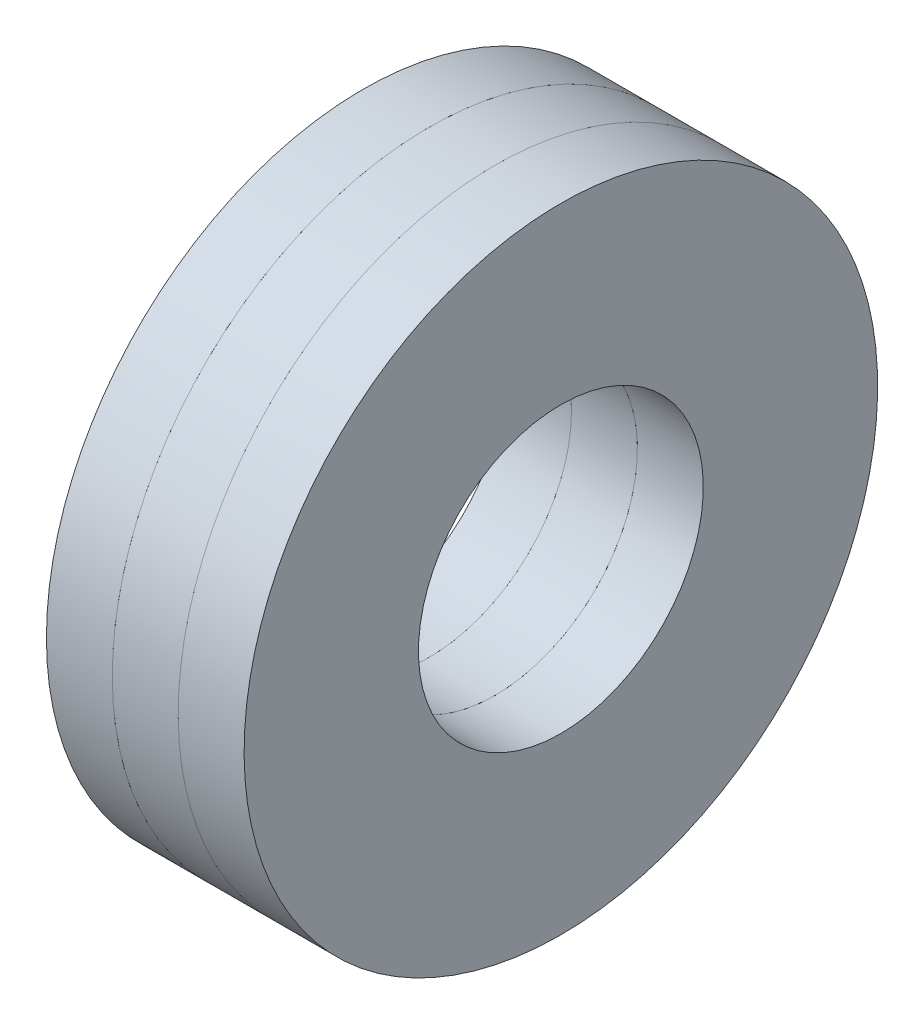
ISO-10303-21;
HEADER;
FILE_DESCRIPTION(('STEP AP214'),'2;1');
FILE_NAME('part.step','',(''),(''),'','','');
FILE_SCHEMA(('AUTOMOTIVE_DESIGN { 1 0 10303 214 1 1 1 1 }'));
ENDSEC;
DATA;
#1=APPLICATION_CONTEXT('core data for automotive mechanical design processes');
#2=APPLICATION_PROTOCOL_DEFINITION('international standard','automotive_design',2000,#1);
#3=PRODUCT_CONTEXT('',#1,'mechanical');
#4=PRODUCT('Part','Part','',(#3));
#5=PRODUCT_RELATED_PRODUCT_CATEGORY('part','',(#4));
#6=PRODUCT_DEFINITION_FORMATION('','',#4);
#7=PRODUCT_DEFINITION_CONTEXT('part definition',#1,'design');
#8=PRODUCT_DEFINITION('design','',#6,#7);
#9=PRODUCT_DEFINITION_SHAPE('','',#8);
#10=(LENGTH_UNIT() NAMED_UNIT(*) SI_UNIT(.MILLI.,.METRE.));
#11=(NAMED_UNIT(*) PLANE_ANGLE_UNIT() SI_UNIT($,.RADIAN.));
#12=(NAMED_UNIT(*) SI_UNIT($,.STERADIAN.) SOLID_ANGLE_UNIT());
#13=UNCERTAINTY_MEASURE_WITH_UNIT(LENGTH_MEASURE(1.E-05),#10,'distance_accuracy_value','');
#14=(GEOMETRIC_REPRESENTATION_CONTEXT(3) GLOBAL_UNCERTAINTY_ASSIGNED_CONTEXT((#13)) GLOBAL_UNIT_ASSIGNED_CONTEXT((#10,
#11,#12)) REPRESENTATION_CONTEXT('',''));
#15=CARTESIAN_POINT('',(0.,0.,0.));
#16=DIRECTION('',(0.,0.,1.));
#17=DIRECTION('',(1.,0.,0.));
#18=AXIS2_PLACEMENT_3D('',#15,#16,#17);
#19=CARTESIAN_POINT('',(-31.563667746159,1.58929944387864,-2.41787070547161));
#20=DIRECTION('',(-1.,0.,0.));
#21=DIRECTION('',(0.,0.,1.));
#22=AXIS2_PLACEMENT_3D('',#19,#20,#21);
#23=CYLINDRICAL_SURFACE('',#22,3.5687);
#24=CARTESIAN_POINT('',(3.36133225384091,1.58929944387864,-2.41787070547161));
#25=DIRECTION('',(-1.,0.,0.));
#26=DIRECTION('',(0.,0.,1.));
#27=AXIS2_PLACEMENT_3D('',#24,#25,#26);
#28=CIRCLE('',#27,3.5687);
#29=CARTESIAN_POINT('',(3.36133225384091,1.58929944387864,1.15082929452839));
#30=VERTEX_POINT('',#29);
#31=EDGE_CURVE('P0_E10',#30,#30,#28,.T.);
#32=ORIENTED_EDGE('',*,*,#31,.F.);
#33=EDGE_LOOP('',(#32));
#34=FACE_BOUND('',#33,.T.);
#35=CARTESIAN_POINT('',(1.71033225384091,1.58929944387864,-2.41787070547161));
#36=DIRECTION('',(-1.,0.,0.));
#37=DIRECTION('',(0.,0.,1.));
#38=AXIS2_PLACEMENT_3D('',#35,#36,#37);
#39=CIRCLE('',#38,3.5687);
#40=CARTESIAN_POINT('',(1.71033225384091,1.58929944387864,1.15082929452839));
#41=VERTEX_POINT('',#40);
#42=EDGE_CURVE('P0_E28',#41,#41,#39,.T.);
#43=ORIENTED_EDGE('',*,*,#42,.T.);
#44=EDGE_LOOP('',(#43));
#45=FACE_BOUND('',#44,.T.);
#46=ADVANCED_FACE('P0_F14',(#34,#45),#23,.F.);
#47=CARTESIAN_POINT('',(3.36133225384091,5.15799944387864,-2.41787070547161));
#48=DIRECTION('',(-1.,0.,0.));
#49=DIRECTION('',(0.,0.,1.));
#50=AXIS2_PLACEMENT_3D('',#47,#48,#49);
#51=PLANE('',#50);
#52=CARTESIAN_POINT('',(3.36133225384091,1.58929944387864,-2.41787070547161));
#53=DIRECTION('',(-1.,0.,0.));
#54=DIRECTION('',(0.,0.,1.));
#55=AXIS2_PLACEMENT_3D('',#52,#53,#54);
#56=CIRCLE('',#55,7.9375);
#57=CARTESIAN_POINT('',(3.36133225384091,1.58929944387864,5.51962929452839));
#58=VERTEX_POINT('',#57);
#59=EDGE_CURVE('P0_E20',#58,#58,#56,.T.);
#60=ORIENTED_EDGE('',*,*,#59,.F.);
#61=EDGE_LOOP('',(#60));
#62=FACE_BOUND('',#61,.T.);
#63=ORIENTED_EDGE('',*,*,#31,.T.);
#64=EDGE_LOOP('',(#63));
#65=FACE_BOUND('',#64,.T.);
#66=ADVANCED_FACE('P0_F43',(#62,#65),#51,.F.);
#67=CARTESIAN_POINT('',(-31.563667746159,1.58929944387864,-2.41787070547161));
#68=DIRECTION('',(-1.,0.,0.));
#69=DIRECTION('',(0.,0.,1.));
#70=AXIS2_PLACEMENT_3D('',#67,#68,#69);
#71=CYLINDRICAL_SURFACE('',#70,7.9375);
#72=CARTESIAN_POINT('',(1.71033225384091,1.58929944387864,-2.41787070547161));
#73=DIRECTION('',(-1.,0.,0.));
#74=DIRECTION('',(0.,0.,1.));
#75=AXIS2_PLACEMENT_3D('',#72,#73,#74);
#76=CIRCLE('',#75,7.9375);
#77=CARTESIAN_POINT('',(1.71033225384091,1.58929944387864,5.51962929452839));
#78=VERTEX_POINT('',#77);
#79=EDGE_CURVE('P0_E24',#78,#78,#76,.T.);
#80=ORIENTED_EDGE('',*,*,#79,.F.);
#81=EDGE_LOOP('',(#80));
#82=FACE_BOUND('',#81,.T.);
#83=ORIENTED_EDGE('',*,*,#59,.T.);
#84=EDGE_LOOP('',(#83));
#85=FACE_BOUND('',#84,.T.);
#86=ADVANCED_FACE('P0_F38',(#82,#85),#71,.T.);
#87=CARTESIAN_POINT('',(1.71033225384091,9.52679944387864,-2.41787070547161));
#88=DIRECTION('',(1.,0.,0.));
#89=DIRECTION('',(0.,0.,-1.));
#90=AXIS2_PLACEMENT_3D('',#87,#88,#89);
#91=PLANE('',#90);
#92=ORIENTED_EDGE('',*,*,#42,.F.);
#93=EDGE_LOOP('',(#92));
#94=FACE_BOUND('',#93,.T.);
#95=ORIENTED_EDGE('',*,*,#79,.T.);
#96=EDGE_LOOP('',(#95));
#97=FACE_BOUND('',#96,.T.);
#98=ADVANCED_FACE('P0_F35',(#94,#97),#91,.F.);
#99=CLOSED_SHELL('',(#46,#66,#86,#98));
#100=MANIFOLD_SOLID_BREP('P0_B1',#99);
#101=CARTESIAN_POINT('',(38.2863322538409,1.58929944387864,-2.41787070547162));
#102=DIRECTION('',(1.,0.,0.));
#103=DIRECTION('',(0.,0.934083853091867,0.35705371499685));
#104=AXIS2_PLACEMENT_3D('',#101,#102,#103);
#105=CYLINDRICAL_SURFACE('',#104,3.5687);
#106=CARTESIAN_POINT('',(3.36133225384091,1.58929944387864,-2.41787070547162));
#107=DIRECTION('',(1.,0.,0.));
#108=DIRECTION('',(0.,0.934083853091867,0.35705371499685));
#109=AXIS2_PLACEMENT_3D('',#106,#107,#108);
#110=CIRCLE('',#109,3.5687);
#111=CARTESIAN_POINT('',(3.36133225384091,4.92276449040759,-1.14365311276236));
#112=VERTEX_POINT('',#111);
#113=EDGE_CURVE('P1_E10',#112,#112,#110,.T.);
#114=ORIENTED_EDGE('',*,*,#113,.F.);
#115=EDGE_LOOP('',(#114));
#116=FACE_BOUND('',#115,.T.);
#117=CARTESIAN_POINT('',(5.01233225384091,1.58929944387864,-2.41787070547162));
#118=DIRECTION('',(1.,0.,0.));
#119=DIRECTION('',(0.,0.934083853091867,0.35705371499685));
#120=AXIS2_PLACEMENT_3D('',#117,#118,#119);
#121=CIRCLE('',#120,3.5687);
#122=CARTESIAN_POINT('',(5.01233225384091,4.92276449040759,-1.14365311276236));
#123=VERTEX_POINT('',#122);
#124=EDGE_CURVE('P1_E32',#123,#123,#121,.T.);
#125=ORIENTED_EDGE('',*,*,#124,.T.);
#126=EDGE_LOOP('',(#125));
#127=FACE_BOUND('',#126,.T.);
#128=ADVANCED_FACE('P1_F14',(#116,#127),#105,.F.);
#129=CARTESIAN_POINT('',(3.36133225384091,0.315081851169382,0.915594341057329));
#130=DIRECTION('',(1.,0.,0.));
#131=DIRECTION('',(0.,0.934083853091867,0.35705371499685));
#132=AXIS2_PLACEMENT_3D('',#129,#130,#131);
#133=PLANE('',#132);
#134=CARTESIAN_POINT('',(3.36133225384091,1.58929944387864,-2.41787070547162));
#135=DIRECTION('',(1.,0.,0.));
#136=DIRECTION('',(0.,0.934083853091867,0.35705371499685));
#137=AXIS2_PLACEMENT_3D('',#134,#135,#136);
#138=CIRCLE('',#137,7.9375);
#139=CARTESIAN_POINT('',(3.36133225384091,9.00359002779533,0.416243157315883));
#140=VERTEX_POINT('',#139);
#141=EDGE_CURVE('P1_E21',#140,#140,#138,.T.);
#142=ORIENTED_EDGE('',*,*,#141,.F.);
#143=EDGE_LOOP('',(#142));
#144=FACE_BOUND('',#143,.T.);
#145=ORIENTED_EDGE('',*,*,#113,.T.);
#146=EDGE_LOOP('',(#145));
#147=FACE_BOUND('',#146,.T.);
#148=ADVANCED_FACE('P1_F48',(#144,#147),#133,.F.);
#149=CARTESIAN_POINT('',(38.2863322538409,1.58929944387864,-2.41787070547162));
#150=DIRECTION('',(1.,0.,0.));
#151=DIRECTION('',(0.,0.934083853091867,0.35705371499685));
#152=AXIS2_PLACEMENT_3D('',#149,#150,#151);
#153=CYLINDRICAL_SURFACE('',#152,7.9375);
#154=CARTESIAN_POINT('',(5.01233225384091,1.58929944387864,-2.41787070547162));
#155=DIRECTION('',(1.,0.,0.));
#156=DIRECTION('',(0.,0.934083853091867,0.35705371499685));
#157=AXIS2_PLACEMENT_3D('',#154,#155,#156);
#158=CIRCLE('',#157,7.9375);
#159=CARTESIAN_POINT('',(5.01233225384091,9.00359002779533,0.416243157315883));
#160=VERTEX_POINT('',#159);
#161=EDGE_CURVE('P1_E27',#160,#160,#158,.T.);
#162=ORIENTED_EDGE('',*,*,#161,.F.);
#163=EDGE_LOOP('',(#162));
#164=FACE_BOUND('',#163,.T.);
#165=ORIENTED_EDGE('',*,*,#141,.T.);
#166=EDGE_LOOP('',(#165));
#167=FACE_BOUND('',#166,.T.);
#168=ADVANCED_FACE('P1_F43',(#164,#167),#153,.T.);
#169=CARTESIAN_POINT('',(5.01233225384091,-1.24481441890886,4.99641987844508));
#170=DIRECTION('',(-1.,0.,0.));
#171=DIRECTION('',(0.,-0.934083853091867,-0.35705371499685));
#172=AXIS2_PLACEMENT_3D('',#169,#170,#171);
#173=PLANE('',#172);
#174=ORIENTED_EDGE('',*,*,#124,.F.);
#175=EDGE_LOOP('',(#174));
#176=FACE_BOUND('',#175,.T.);
#177=ORIENTED_EDGE('',*,*,#161,.T.);
#178=EDGE_LOOP('',(#177));
#179=FACE_BOUND('',#178,.T.);
#180=ADVANCED_FACE('P1_F40',(#176,#179),#173,.F.);
#181=CLOSED_SHELL('',(#128,#148,#168,#180));
#182=MANIFOLD_SOLID_BREP('P1_B1',#181);
#183=CARTESIAN_POINT('',(-28.261667746159,1.58929944387864,-2.41787070547161));
#184=DIRECTION('',(-1.,0.,0.));
#185=DIRECTION('',(0.,0.956513638358397,0.291687606240618));
#186=AXIS2_PLACEMENT_3D('',#183,#184,#185);
#187=CYLINDRICAL_SURFACE('',#186,3.5687);
#188=CARTESIAN_POINT('',(6.66333225384091,1.58929944387864,-2.41787070547161));
#189=DIRECTION('',(-1.,0.,0.));
#190=DIRECTION('',(0.,0.956513638358397,0.291687606240618));
#191=AXIS2_PLACEMENT_3D('',#188,#189,#190);
#192=CIRCLE('',#191,3.5687);
#193=CARTESIAN_POINT('',(6.66333225384091,5.00280966508826,-1.37692514508072));
#194=VERTEX_POINT('',#193);
#195=EDGE_CURVE('P2_E10',#194,#194,#192,.T.);
#196=ORIENTED_EDGE('',*,*,#195,.F.);
#197=EDGE_LOOP('',(#196));
#198=FACE_BOUND('',#197,.T.);
#199=CARTESIAN_POINT('',(5.01233225384091,1.58929944387864,-2.41787070547161));
#200=DIRECTION('',(-1.,0.,0.));
#201=DIRECTION('',(0.,0.956513638358397,0.291687606240618));
#202=AXIS2_PLACEMENT_3D('',#199,#200,#201);
#203=CIRCLE('',#202,3.5687);
#204=CARTESIAN_POINT('',(5.01233225384091,5.00280966508826,-1.37692514508072));
#205=VERTEX_POINT('',#204);
#206=EDGE_CURVE('P2_E28',#205,#205,#203,.T.);
#207=ORIENTED_EDGE('',*,*,#206,.T.);
#208=EDGE_LOOP('',(#207));
#209=FACE_BOUND('',#208,.T.);
#210=ADVANCED_FACE('P2_F14',(#198,#209),#187,.F.);
#211=CARTESIAN_POINT('',(6.66333225384091,2.63024500426954,-5.83138092668123));
#212=DIRECTION('',(-1.,0.,0.));
#213=DIRECTION('',(0.,0.956513638358397,0.291687606240618));
#214=AXIS2_PLACEMENT_3D('',#211,#212,#213);
#215=PLANE('',#214);
#216=CARTESIAN_POINT('',(6.66333225384091,1.58929944387864,-2.41787070547161));
#217=DIRECTION('',(-1.,0.,0.));
#218=DIRECTION('',(0.,0.956513638358397,0.291687606240618));
#219=AXIS2_PLACEMENT_3D('',#216,#217,#218);
#220=CIRCLE('',#219,7.9375);
#221=CARTESIAN_POINT('',(6.66333225384091,9.18162644834842,-0.102600330936707));
#222=VERTEX_POINT('',#221);
#223=EDGE_CURVE('P2_E20',#222,#222,#220,.T.);
#224=ORIENTED_EDGE('',*,*,#223,.F.);
#225=EDGE_LOOP('',(#224));
#226=FACE_BOUND('',#225,.T.);
#227=ORIENTED_EDGE('',*,*,#195,.T.);
#228=EDGE_LOOP('',(#227));
#229=FACE_BOUND('',#228,.T.);
#230=ADVANCED_FACE('P2_F43',(#226,#229),#215,.F.);
#231=CARTESIAN_POINT('',(-28.261667746159,1.58929944387864,-2.41787070547161));
#232=DIRECTION('',(-1.,0.,0.));
#233=DIRECTION('',(0.,0.956513638358397,0.291687606240618));
#234=AXIS2_PLACEMENT_3D('',#231,#232,#233);
#235=CYLINDRICAL_SURFACE('',#234,7.9375);
#236=CARTESIAN_POINT('',(5.01233225384091,1.58929944387864,-2.41787070547161));
#237=DIRECTION('',(-1.,0.,0.));
#238=DIRECTION('',(0.,0.956513638358397,0.291687606240618));
#239=AXIS2_PLACEMENT_3D('',#236,#237,#238);
#240=CIRCLE('',#239,7.9375);
#241=CARTESIAN_POINT('',(5.01233225384091,9.18162644834842,-0.102600330936707));
#242=VERTEX_POINT('',#241);
#243=EDGE_CURVE('P2_E24',#242,#242,#240,.T.);
#244=ORIENTED_EDGE('',*,*,#243,.F.);
#245=EDGE_LOOP('',(#244));
#246=FACE_BOUND('',#245,.T.);
#247=ORIENTED_EDGE('',*,*,#223,.T.);
#248=EDGE_LOOP('',(#247));
#249=FACE_BOUND('',#248,.T.);
#250=ADVANCED_FACE('P2_F38',(#246,#249),#235,.T.);
#251=CARTESIAN_POINT('',(5.01233225384091,3.90456981841355,-10.0101977099414));
#252=DIRECTION('',(1.,0.,0.));
#253=DIRECTION('',(0.,-0.956513638358397,-0.291687606240618));
#254=AXIS2_PLACEMENT_3D('',#251,#252,#253);
#255=PLANE('',#254);
#256=ORIENTED_EDGE('',*,*,#206,.F.);
#257=EDGE_LOOP('',(#256));
#258=FACE_BOUND('',#257,.T.);
#259=ORIENTED_EDGE('',*,*,#243,.T.);
#260=EDGE_LOOP('',(#259));
#261=FACE_BOUND('',#260,.T.);
#262=ADVANCED_FACE('P2_F35',(#258,#261),#255,.F.);
#263=CLOSED_SHELL('',(#210,#230,#250,#262));
#264=MANIFOLD_SOLID_BREP('P2_B1',#263);
#265=ADVANCED_BREP_SHAPE_REPRESENTATION('',(#18,#100,#182,#264),#14);
#266=SHAPE_DEFINITION_REPRESENTATION(#9,#265);
ENDSEC;
END-ISO-10303-21;
